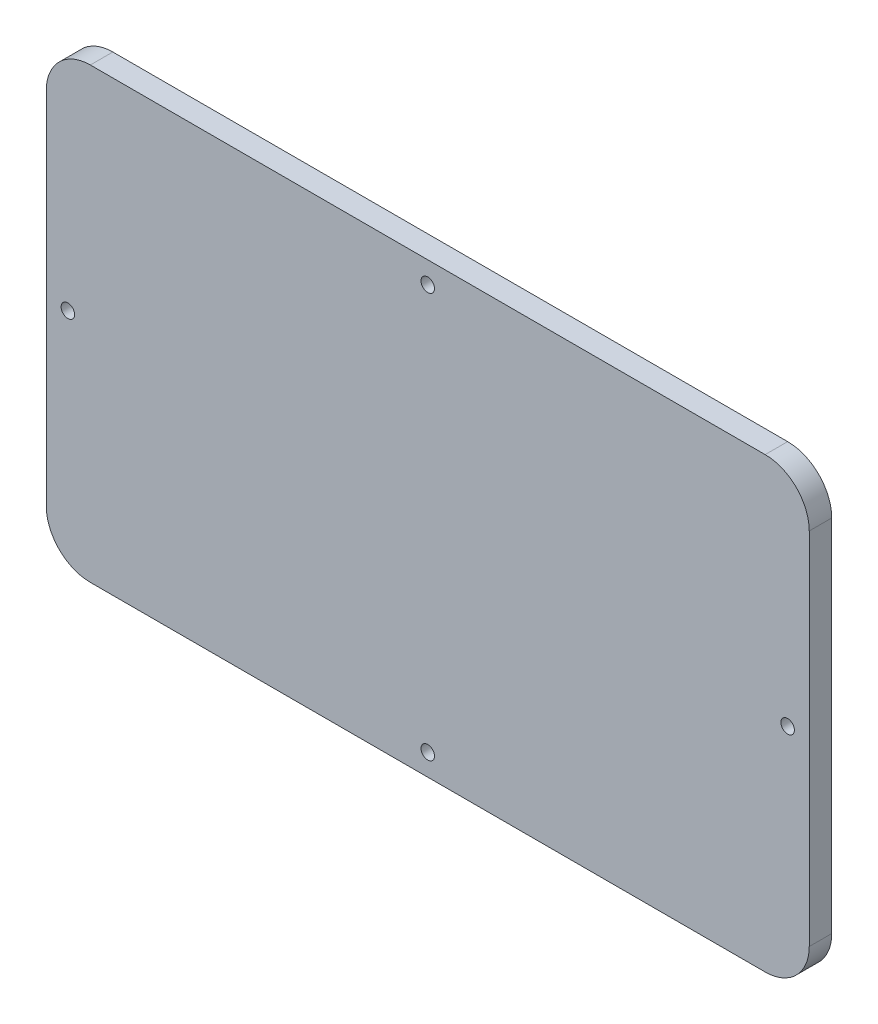
ISO-10303-21;
HEADER;
FILE_DESCRIPTION(('STEP AP214'),'2;1');
FILE_NAME('part.step','',(''),(''),'','','');
FILE_SCHEMA(('AUTOMOTIVE_DESIGN { 1 0 10303 214 1 1 1 1 }'));
ENDSEC;
DATA;
#1=APPLICATION_CONTEXT('core data for automotive mechanical design processes');
#2=APPLICATION_PROTOCOL_DEFINITION('international standard','automotive_design',2000,#1);
#3=PRODUCT_CONTEXT('',#1,'mechanical');
#4=PRODUCT('Part','Part','',(#3));
#5=PRODUCT_RELATED_PRODUCT_CATEGORY('part','',(#4));
#6=PRODUCT_DEFINITION_FORMATION('','',#4);
#7=PRODUCT_DEFINITION_CONTEXT('part definition',#1,'design');
#8=PRODUCT_DEFINITION('design','',#6,#7);
#9=PRODUCT_DEFINITION_SHAPE('','',#8);
#10=(LENGTH_UNIT() NAMED_UNIT(*) SI_UNIT(.MILLI.,.METRE.));
#11=(NAMED_UNIT(*) PLANE_ANGLE_UNIT() SI_UNIT($,.RADIAN.));
#12=(NAMED_UNIT(*) SI_UNIT($,.STERADIAN.) SOLID_ANGLE_UNIT());
#13=UNCERTAINTY_MEASURE_WITH_UNIT(LENGTH_MEASURE(1.E-05),#10,'distance_accuracy_value','');
#14=(GEOMETRIC_REPRESENTATION_CONTEXT(3) GLOBAL_UNCERTAINTY_ASSIGNED_CONTEXT((#13)) GLOBAL_UNIT_ASSIGNED_CONTEXT((#10,
#11,#12)) REPRESENTATION_CONTEXT('',''));
#15=CARTESIAN_POINT('',(0.,0.,0.));
#16=DIRECTION('',(0.,0.,1.));
#17=DIRECTION('',(1.,0.,0.));
#18=AXIS2_PLACEMENT_3D('',#15,#16,#17);
#19=CARTESIAN_POINT('',(84.8,0.,5.));
#20=DIRECTION('',(-1.,0.,0.));
#21=DIRECTION('',(0.,0.,1.));
#22=AXIS2_PLACEMENT_3D('',#19,#20,#21);
#23=PLANE('',#22);
#24=DIRECTION('',(0.,1.,0.));
#25=VECTOR('',#24,1.);
#26=CARTESIAN_POINT('',(84.8,0.,0.));
#27=LINE('',#26,#25);
#28=CARTESIAN_POINT('',(84.8,-39.9999999999999,0.));
#29=VERTEX_POINT('',#28);
#30=CARTESIAN_POINT('',(84.8,39.9999999999999,0.));
#31=VERTEX_POINT('',#30);
#32=EDGE_CURVE('E163',#29,#31,#27,.T.);
#33=ORIENTED_EDGE('',*,*,#32,.T.);
#34=DIRECTION('',(0.,0.,-1.));
#35=VECTOR('',#34,1.);
#36=CARTESIAN_POINT('',(84.8,39.9999999999999,5.));
#37=LINE('',#36,#35);
#38=CARTESIAN_POINT('',(84.8,39.9999999999999,5.));
#39=VERTEX_POINT('',#38);
#40=EDGE_CURVE('E11',#39,#31,#37,.T.);
#41=ORIENTED_EDGE('',*,*,#40,.F.);
#42=DIRECTION('',(0.,1.,0.));
#43=VECTOR('',#42,1.);
#44=CARTESIAN_POINT('',(84.8,0.,5.));
#45=LINE('',#44,#43);
#46=CARTESIAN_POINT('',(84.8,-39.9999999999999,5.));
#47=VERTEX_POINT('',#46);
#48=EDGE_CURVE('E232',#47,#39,#45,.T.);
#49=ORIENTED_EDGE('',*,*,#48,.F.);
#50=DIRECTION('',(0.,0.,-1.));
#51=VECTOR('',#50,1.);
#52=CARTESIAN_POINT('',(84.8,-39.9999999999999,5.));
#53=LINE('',#52,#51);
#54=EDGE_CURVE('E150',#47,#29,#53,.T.);
#55=ORIENTED_EDGE('',*,*,#54,.T.);
#56=EDGE_LOOP('',(#33,#41,#49,#55));
#57=FACE_BOUND('',#56,.T.);
#58=ADVANCED_FACE('F46',(#57),#23,.F.);
#59=CARTESIAN_POINT('',(75.,40.,5.));
#60=DIRECTION('',(0.,0.,-1.));
#61=DIRECTION('',(-1.,0.,0.));
#62=AXIS2_PLACEMENT_3D('',#59,#60,#61);
#63=CYLINDRICAL_SURFACE('',#62,9.79999999999999);
#64=CARTESIAN_POINT('',(75.,40.,0.));
#65=DIRECTION('',(0.,0.,1.));
#66=DIRECTION('',(1.,0.,0.));
#67=AXIS2_PLACEMENT_3D('',#64,#65,#66);
#68=CIRCLE('',#67,9.79999999999999);
#69=CARTESIAN_POINT('',(74.9999999999999,49.8,0.));
#70=VERTEX_POINT('',#69);
#71=EDGE_CURVE('E167',#31,#70,#68,.T.);
#72=ORIENTED_EDGE('',*,*,#71,.T.);
#73=DIRECTION('',(0.,0.,-1.));
#74=VECTOR('',#73,1.);
#75=CARTESIAN_POINT('',(74.9999999999999,49.8,5.));
#76=LINE('',#75,#74);
#77=CARTESIAN_POINT('',(74.9999999999999,49.8,5.));
#78=VERTEX_POINT('',#77);
#79=EDGE_CURVE('E56',#78,#70,#76,.T.);
#80=ORIENTED_EDGE('',*,*,#79,.F.);
#81=CARTESIAN_POINT('',(75.,40.,5.));
#82=DIRECTION('',(0.,0.,1.));
#83=DIRECTION('',(1.,0.,0.));
#84=AXIS2_PLACEMENT_3D('',#81,#82,#83);
#85=CIRCLE('',#84,9.79999999999999);
#86=EDGE_CURVE('E103',#39,#78,#85,.T.);
#87=ORIENTED_EDGE('',*,*,#86,.F.);
#88=ORIENTED_EDGE('',*,*,#40,.T.);
#89=EDGE_LOOP('',(#72,#80,#87,#88));
#90=FACE_BOUND('',#89,.T.);
#91=ADVANCED_FACE('F275',(#90),#63,.T.);
#92=CARTESIAN_POINT('',(0.,49.8,5.));
#93=DIRECTION('',(0.,-1.,0.));
#94=DIRECTION('',(0.,0.,-1.));
#95=AXIS2_PLACEMENT_3D('',#92,#93,#94);
#96=PLANE('',#95);
#97=DIRECTION('',(-1.,0.,0.));
#98=VECTOR('',#97,1.);
#99=CARTESIAN_POINT('',(0.,49.8,0.));
#100=LINE('',#99,#98);
#101=CARTESIAN_POINT('',(-74.9999999999999,49.8,0.));
#102=VERTEX_POINT('',#101);
#103=EDGE_CURVE('E170',#70,#102,#100,.T.);
#104=ORIENTED_EDGE('',*,*,#103,.T.);
#105=DIRECTION('',(0.,0.,-1.));
#106=VECTOR('',#105,1.);
#107=CARTESIAN_POINT('',(-74.9999999999999,49.8,5.));
#108=LINE('',#107,#106);
#109=CARTESIAN_POINT('',(-74.9999999999999,49.8,5.));
#110=VERTEX_POINT('',#109);
#111=EDGE_CURVE('E202',#110,#102,#108,.T.);
#112=ORIENTED_EDGE('',*,*,#111,.F.);
#113=DIRECTION('',(-1.,0.,0.));
#114=VECTOR('',#113,1.);
#115=CARTESIAN_POINT('',(0.,49.8,5.));
#116=LINE('',#115,#114);
#117=EDGE_CURVE('E212',#78,#110,#116,.T.);
#118=ORIENTED_EDGE('',*,*,#117,.F.);
#119=ORIENTED_EDGE('',*,*,#79,.T.);
#120=EDGE_LOOP('',(#104,#112,#118,#119));
#121=FACE_BOUND('',#120,.T.);
#122=ADVANCED_FACE('F210',(#121),#96,.F.);
#123=CARTESIAN_POINT('',(-75.,40.,5.));
#124=DIRECTION('',(0.,0.,-1.));
#125=DIRECTION('',(-1.,0.,0.));
#126=AXIS2_PLACEMENT_3D('',#123,#124,#125);
#127=CYLINDRICAL_SURFACE('',#126,9.8);
#128=CARTESIAN_POINT('',(-75.,40.,0.));
#129=DIRECTION('',(0.,0.,1.));
#130=DIRECTION('',(1.,0.,0.));
#131=AXIS2_PLACEMENT_3D('',#128,#129,#130);
#132=CIRCLE('',#131,9.8);
#133=CARTESIAN_POINT('',(-84.8,39.9999999999999,0.));
#134=VERTEX_POINT('',#133);
#135=EDGE_CURVE('E173',#102,#134,#132,.T.);
#136=ORIENTED_EDGE('',*,*,#135,.T.);
#137=DIRECTION('',(0.,0.,-1.));
#138=VECTOR('',#137,1.);
#139=CARTESIAN_POINT('',(-84.8,39.9999999999999,5.));
#140=LINE('',#139,#138);
#141=CARTESIAN_POINT('',(-84.8,39.9999999999999,5.));
#142=VERTEX_POINT('',#141);
#143=EDGE_CURVE('E199',#142,#134,#140,.T.);
#144=ORIENTED_EDGE('',*,*,#143,.F.);
#145=CARTESIAN_POINT('',(-75.,40.,5.));
#146=DIRECTION('',(0.,0.,1.));
#147=DIRECTION('',(1.,0.,0.));
#148=AXIS2_PLACEMENT_3D('',#145,#146,#147);
#149=CIRCLE('',#148,9.8);
#150=EDGE_CURVE('E223',#110,#142,#149,.T.);
#151=ORIENTED_EDGE('',*,*,#150,.F.);
#152=ORIENTED_EDGE('',*,*,#111,.T.);
#153=EDGE_LOOP('',(#136,#144,#151,#152));
#154=FACE_BOUND('',#153,.T.);
#155=ADVANCED_FACE('F221',(#154),#127,.T.);
#156=CARTESIAN_POINT('',(-84.8,0.,5.));
#157=DIRECTION('',(-1.,0.,0.));
#158=DIRECTION('',(0.,0.,1.));
#159=AXIS2_PLACEMENT_3D('',#156,#157,#158);
#160=PLANE('',#159);
#161=DIRECTION('',(0.,1.,0.));
#162=VECTOR('',#161,1.);
#163=CARTESIAN_POINT('',(-84.8,0.,0.));
#164=LINE('',#163,#162);
#165=CARTESIAN_POINT('',(-84.8,-40.,0.));
#166=VERTEX_POINT('',#165);
#167=EDGE_CURVE('E177',#166,#134,#164,.T.);
#168=ORIENTED_EDGE('',*,*,#167,.F.);
#169=DIRECTION('',(0.,0.,-1.));
#170=VECTOR('',#169,1.);
#171=CARTESIAN_POINT('',(-84.8,-40.,5.));
#172=LINE('',#171,#170);
#173=CARTESIAN_POINT('',(-84.8,-40.,5.));
#174=VERTEX_POINT('',#173);
#175=EDGE_CURVE('E129',#174,#166,#172,.T.);
#176=ORIENTED_EDGE('',*,*,#175,.F.);
#177=DIRECTION('',(0.,1.,0.));
#178=VECTOR('',#177,1.);
#179=CARTESIAN_POINT('',(-84.8,0.,5.));
#180=LINE('',#179,#178);
#181=EDGE_CURVE('E136',#174,#142,#180,.T.);
#182=ORIENTED_EDGE('',*,*,#181,.T.);
#183=ORIENTED_EDGE('',*,*,#143,.T.);
#184=EDGE_LOOP('',(#168,#176,#182,#183));
#185=FACE_BOUND('',#184,.T.);
#186=ADVANCED_FACE('F286',(#185),#160,.T.);
#187=CARTESIAN_POINT('',(-75.,-40.,5.));
#188=DIRECTION('',(0.,0.,-1.));
#189=DIRECTION('',(-1.,0.,0.));
#190=AXIS2_PLACEMENT_3D('',#187,#188,#189);
#191=CYLINDRICAL_SURFACE('',#190,9.79999999999999);
#192=CARTESIAN_POINT('',(-75.,-40.,0.));
#193=DIRECTION('',(0.,0.,1.));
#194=DIRECTION('',(1.,0.,0.));
#195=AXIS2_PLACEMENT_3D('',#192,#193,#194);
#196=CIRCLE('',#195,9.79999999999999);
#197=CARTESIAN_POINT('',(-74.9999999999999,-49.8,0.));
#198=VERTEX_POINT('',#197);
#199=EDGE_CURVE('E123',#198,#166,#196,.F.);
#200=ORIENTED_EDGE('',*,*,#199,.F.);
#201=DIRECTION('',(0.,0.,-1.));
#202=VECTOR('',#201,1.);
#203=CARTESIAN_POINT('',(-74.9999999999999,-49.8,5.));
#204=LINE('',#203,#202);
#205=CARTESIAN_POINT('',(-74.9999999999999,-49.8,5.));
#206=VERTEX_POINT('',#205);
#207=EDGE_CURVE('E118',#206,#198,#204,.T.);
#208=ORIENTED_EDGE('',*,*,#207,.F.);
#209=CARTESIAN_POINT('',(-75.,-40.,5.));
#210=DIRECTION('',(0.,0.,1.));
#211=DIRECTION('',(1.,0.,0.));
#212=AXIS2_PLACEMENT_3D('',#209,#210,#211);
#213=CIRCLE('',#212,9.79999999999999);
#214=EDGE_CURVE('E121',#206,#174,#213,.F.);
#215=ORIENTED_EDGE('',*,*,#214,.T.);
#216=ORIENTED_EDGE('',*,*,#175,.T.);
#217=EDGE_LOOP('',(#200,#208,#215,#216));
#218=FACE_BOUND('',#217,.T.);
#219=ADVANCED_FACE('F120',(#218),#191,.T.);
#220=CARTESIAN_POINT('',(0.,-49.8,5.));
#221=DIRECTION('',(0.,-1.,0.));
#222=DIRECTION('',(1.,0.,0.));
#223=AXIS2_PLACEMENT_3D('',#220,#221,#222);
#224=PLANE('',#223);
#225=DIRECTION('',(-1.,0.,0.));
#226=VECTOR('',#225,1.);
#227=CARTESIAN_POINT('',(0.,-49.8,0.));
#228=LINE('',#227,#226);
#229=CARTESIAN_POINT('',(74.9999999999999,-49.8,0.));
#230=VERTEX_POINT('',#229);
#231=EDGE_CURVE('E183',#230,#198,#228,.T.);
#232=ORIENTED_EDGE('',*,*,#231,.F.);
#233=DIRECTION('',(0.,0.,-1.));
#234=VECTOR('',#233,1.);
#235=CARTESIAN_POINT('',(74.9999999999999,-49.8,5.));
#236=LINE('',#235,#234);
#237=CARTESIAN_POINT('',(74.9999999999999,-49.8,5.));
#238=VERTEX_POINT('',#237);
#239=EDGE_CURVE('E92',#238,#230,#236,.T.);
#240=ORIENTED_EDGE('',*,*,#239,.F.);
#241=DIRECTION('',(-1.,0.,0.));
#242=VECTOR('',#241,1.);
#243=CARTESIAN_POINT('',(0.,-49.8,5.));
#244=LINE('',#243,#242);
#245=EDGE_CURVE('E134',#238,#206,#244,.T.);
#246=ORIENTED_EDGE('',*,*,#245,.T.);
#247=ORIENTED_EDGE('',*,*,#207,.T.);
#248=EDGE_LOOP('',(#232,#240,#246,#247));
#249=FACE_BOUND('',#248,.T.);
#250=ADVANCED_FACE('F139',(#249),#224,.T.);
#251=CARTESIAN_POINT('',(75.,-40.,5.));
#252=DIRECTION('',(0.,0.,-1.));
#253=DIRECTION('',(-1.,0.,0.));
#254=AXIS2_PLACEMENT_3D('',#251,#252,#253);
#255=CYLINDRICAL_SURFACE('',#254,9.79999999999999);
#256=CARTESIAN_POINT('',(75.,-40.,0.));
#257=DIRECTION('',(0.,0.,1.));
#258=DIRECTION('',(1.,0.,0.));
#259=AXIS2_PLACEMENT_3D('',#256,#257,#258);
#260=CIRCLE('',#259,9.79999999999999);
#261=EDGE_CURVE('E95',#230,#29,#260,.T.);
#262=ORIENTED_EDGE('',*,*,#261,.T.);
#263=ORIENTED_EDGE('',*,*,#54,.F.);
#264=CARTESIAN_POINT('',(75.,-40.,5.));
#265=DIRECTION('',(0.,0.,1.));
#266=DIRECTION('',(1.,0.,0.));
#267=AXIS2_PLACEMENT_3D('',#264,#265,#266);
#268=CIRCLE('',#267,9.79999999999999);
#269=EDGE_CURVE('E64',#238,#47,#268,.T.);
#270=ORIENTED_EDGE('',*,*,#269,.F.);
#271=ORIENTED_EDGE('',*,*,#239,.T.);
#272=EDGE_LOOP('',(#262,#263,#270,#271));
#273=FACE_BOUND('',#272,.T.);
#274=ADVANCED_FACE('F264',(#273),#255,.T.);
#275=CARTESIAN_POINT('',(0.,45.,5.));
#276=DIRECTION('',(0.,0.,-1.));
#277=DIRECTION('',(-1.,0.,0.));
#278=AXIS2_PLACEMENT_3D('',#275,#276,#277);
#279=CYLINDRICAL_SURFACE('',#278,1.5);
#280=CARTESIAN_POINT('',(0.,45.,5.));
#281=DIRECTION('',(0.,0.,1.));
#282=DIRECTION('',(1.,0.,0.));
#283=AXIS2_PLACEMENT_3D('',#280,#281,#282);
#284=CIRCLE('',#283,1.5);
#285=CARTESIAN_POINT('',(1.49999999999998,45.,5.));
#286=VERTEX_POINT('',#285);
#287=EDGE_CURVE('E235',#286,#286,#284,.T.);
#288=ORIENTED_EDGE('',*,*,#287,.T.);
#289=EDGE_LOOP('',(#288));
#290=FACE_BOUND('',#289,.T.);
#291=CARTESIAN_POINT('',(0.,45.,0.));
#292=DIRECTION('',(0.,0.,1.));
#293=DIRECTION('',(1.,0.,0.));
#294=AXIS2_PLACEMENT_3D('',#291,#292,#293);
#295=CIRCLE('',#294,1.5);
#296=CARTESIAN_POINT('',(1.49999999999998,45.,0.));
#297=VERTEX_POINT('',#296);
#298=EDGE_CURVE('E159',#297,#297,#295,.T.);
#299=ORIENTED_EDGE('',*,*,#298,.F.);
#300=EDGE_LOOP('',(#299));
#301=FACE_BOUND('',#300,.T.);
#302=ADVANCED_FACE('F262',(#290,#301),#279,.F.);
#303=CARTESIAN_POINT('',(80.,0.,5.));
#304=DIRECTION('',(0.,0.,-1.));
#305=DIRECTION('',(-1.,0.,0.));
#306=AXIS2_PLACEMENT_3D('',#303,#304,#305);
#307=CYLINDRICAL_SURFACE('',#306,1.5);
#308=CARTESIAN_POINT('',(80.,0.,5.));
#309=DIRECTION('',(0.,0.,1.));
#310=DIRECTION('',(1.,0.,0.));
#311=AXIS2_PLACEMENT_3D('',#308,#309,#310);
#312=CIRCLE('',#311,1.5);
#313=CARTESIAN_POINT('',(81.5,0.,5.));
#314=VERTEX_POINT('',#313);
#315=EDGE_CURVE('E239',#314,#314,#312,.T.);
#316=ORIENTED_EDGE('',*,*,#315,.T.);
#317=EDGE_LOOP('',(#316));
#318=FACE_BOUND('',#317,.T.);
#319=CARTESIAN_POINT('',(80.,0.,0.));
#320=DIRECTION('',(0.,0.,1.));
#321=DIRECTION('',(1.,0.,0.));
#322=AXIS2_PLACEMENT_3D('',#319,#320,#321);
#323=CIRCLE('',#322,1.5);
#324=CARTESIAN_POINT('',(81.5,0.,0.));
#325=VERTEX_POINT('',#324);
#326=EDGE_CURVE('E155',#325,#325,#323,.T.);
#327=ORIENTED_EDGE('',*,*,#326,.F.);
#328=EDGE_LOOP('',(#327));
#329=FACE_BOUND('',#328,.T.);
#330=ADVANCED_FACE('F252',(#318,#329),#307,.F.);
#331=CARTESIAN_POINT('',(0.,-45.,5.));
#332=DIRECTION('',(0.,0.,-1.));
#333=DIRECTION('',(-1.,0.,0.));
#334=AXIS2_PLACEMENT_3D('',#331,#332,#333);
#335=CYLINDRICAL_SURFACE('',#334,1.5);
#336=CARTESIAN_POINT('',(0.,-45.,5.));
#337=DIRECTION('',(0.,0.,1.));
#338=DIRECTION('',(1.,0.,0.));
#339=AXIS2_PLACEMENT_3D('',#336,#337,#338);
#340=CIRCLE('',#339,1.5);
#341=CARTESIAN_POINT('',(1.49999999999999,-45.,5.));
#342=VERTEX_POINT('',#341);
#343=EDGE_CURVE('E192',#342,#342,#340,.F.);
#344=ORIENTED_EDGE('',*,*,#343,.F.);
#345=EDGE_LOOP('',(#344));
#346=FACE_BOUND('',#345,.T.);
#347=CARTESIAN_POINT('',(0.,-45.,0.));
#348=DIRECTION('',(0.,0.,1.));
#349=DIRECTION('',(1.,0.,0.));
#350=AXIS2_PLACEMENT_3D('',#347,#348,#349);
#351=CIRCLE('',#350,1.5);
#352=CARTESIAN_POINT('',(1.49999999999999,-45.,0.));
#353=VERTEX_POINT('',#352);
#354=EDGE_CURVE('E151',#353,#353,#351,.F.);
#355=ORIENTED_EDGE('',*,*,#354,.T.);
#356=EDGE_LOOP('',(#355));
#357=FACE_BOUND('',#356,.T.);
#358=ADVANCED_FACE('F48',(#346,#357),#335,.F.);
#359=CARTESIAN_POINT('',(-80.,0.,5.));
#360=DIRECTION('',(0.,0.,-1.));
#361=DIRECTION('',(-1.,0.,0.));
#362=AXIS2_PLACEMENT_3D('',#359,#360,#361);
#363=CYLINDRICAL_SURFACE('',#362,1.5);
#364=CARTESIAN_POINT('',(-80.,0.,5.));
#365=DIRECTION('',(0.,0.,1.));
#366=DIRECTION('',(1.,0.,0.));
#367=AXIS2_PLACEMENT_3D('',#364,#365,#366);
#368=CIRCLE('',#367,1.5);
#369=CARTESIAN_POINT('',(-78.5,0.,5.));
#370=VERTEX_POINT('',#369);
#371=EDGE_CURVE('E143',#370,#370,#368,.F.);
#372=ORIENTED_EDGE('',*,*,#371,.F.);
#373=EDGE_LOOP('',(#372));
#374=FACE_BOUND('',#373,.T.);
#375=CARTESIAN_POINT('',(-80.,0.,0.));
#376=DIRECTION('',(0.,0.,1.));
#377=DIRECTION('',(1.,0.,0.));
#378=AXIS2_PLACEMENT_3D('',#375,#376,#377);
#379=CIRCLE('',#378,1.5);
#380=CARTESIAN_POINT('',(-78.5,0.,0.));
#381=VERTEX_POINT('',#380);
#382=EDGE_CURVE('E188',#381,#381,#379,.F.);
#383=ORIENTED_EDGE('',*,*,#382,.T.);
#384=EDGE_LOOP('',(#383));
#385=FACE_BOUND('',#384,.T.);
#386=ADVANCED_FACE('F251',(#374,#385),#363,.F.);
#387=CARTESIAN_POINT('',(0.,0.,5.));
#388=DIRECTION('',(0.,0.,1.));
#389=DIRECTION('',(1.,0.,0.));
#390=AXIS2_PLACEMENT_3D('',#387,#388,#389);
#391=PLANE('',#390);
#392=ORIENTED_EDGE('',*,*,#343,.T.);
#393=EDGE_LOOP('',(#392));
#394=FACE_BOUND('',#393,.T.);
#395=ORIENTED_EDGE('',*,*,#315,.F.);
#396=EDGE_LOOP('',(#395));
#397=FACE_BOUND('',#396,.T.);
#398=ORIENTED_EDGE('',*,*,#287,.F.);
#399=EDGE_LOOP('',(#398));
#400=FACE_BOUND('',#399,.T.);
#401=ORIENTED_EDGE('',*,*,#48,.T.);
#402=ORIENTED_EDGE('',*,*,#86,.T.);
#403=ORIENTED_EDGE('',*,*,#117,.T.);
#404=ORIENTED_EDGE('',*,*,#150,.T.);
#405=ORIENTED_EDGE('',*,*,#181,.F.);
#406=ORIENTED_EDGE('',*,*,#214,.F.);
#407=ORIENTED_EDGE('',*,*,#245,.F.);
#408=ORIENTED_EDGE('',*,*,#269,.T.);
#409=EDGE_LOOP('',(#401,#402,#403,#404,#405,#406,#407,#408));
#410=FACE_BOUND('',#409,.T.);
#411=ORIENTED_EDGE('',*,*,#371,.T.);
#412=EDGE_LOOP('',(#411));
#413=FACE_BOUND('',#412,.T.);
#414=ADVANCED_FACE('F132',(#394,#397,#400,#410,#413),#391,.T.);
#415=CARTESIAN_POINT('',(0.,0.,0.));
#416=DIRECTION('',(0.,0.,1.));
#417=DIRECTION('',(1.,0.,0.));
#418=AXIS2_PLACEMENT_3D('',#415,#416,#417);
#419=PLANE('',#418);
#420=ORIENTED_EDGE('',*,*,#354,.F.);
#421=EDGE_LOOP('',(#420));
#422=FACE_BOUND('',#421,.T.);
#423=ORIENTED_EDGE('',*,*,#326,.T.);
#424=EDGE_LOOP('',(#423));
#425=FACE_BOUND('',#424,.T.);
#426=ORIENTED_EDGE('',*,*,#298,.T.);
#427=EDGE_LOOP('',(#426));
#428=FACE_BOUND('',#427,.T.);
#429=ORIENTED_EDGE('',*,*,#32,.F.);
#430=ORIENTED_EDGE('',*,*,#261,.F.);
#431=ORIENTED_EDGE('',*,*,#231,.T.);
#432=ORIENTED_EDGE('',*,*,#199,.T.);
#433=ORIENTED_EDGE('',*,*,#167,.T.);
#434=ORIENTED_EDGE('',*,*,#135,.F.);
#435=ORIENTED_EDGE('',*,*,#103,.F.);
#436=ORIENTED_EDGE('',*,*,#71,.F.);
#437=EDGE_LOOP('',(#429,#430,#431,#432,#433,#434,#435,#436));
#438=FACE_BOUND('',#437,.T.);
#439=ORIENTED_EDGE('',*,*,#382,.F.);
#440=EDGE_LOOP('',(#439));
#441=FACE_BOUND('',#440,.T.);
#442=ADVANCED_FACE('F216',(#422,#425,#428,#438,#441),#419,.F.);
#443=CLOSED_SHELL('',(#58,#91,#122,#155,#186,#219,#250,#274,#302,#330,#358,#386,#414,#442));
#444=MANIFOLD_SOLID_BREP('B2',#443);
#445=ADVANCED_BREP_SHAPE_REPRESENTATION('',(#18,#444),#14);
#446=SHAPE_DEFINITION_REPRESENTATION(#9,#445);
ENDSEC;
END-ISO-10303-21;
